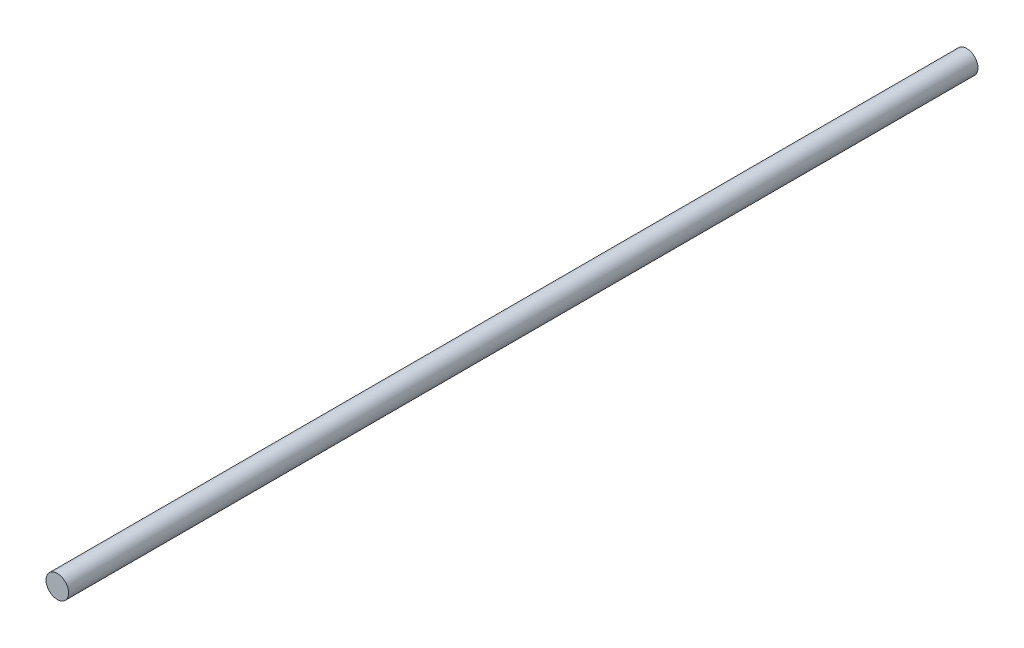
ISO-10303-21;
HEADER;
FILE_DESCRIPTION(('STEP AP214'),'2;1');
FILE_NAME('part.step','',(''),(''),'','','');
FILE_SCHEMA(('AUTOMOTIVE_DESIGN { 1 0 10303 214 1 1 1 1 }'));
ENDSEC;
DATA;
#1=APPLICATION_CONTEXT('core data for automotive mechanical design processes');
#2=APPLICATION_PROTOCOL_DEFINITION('international standard','automotive_design',2000,#1);
#3=PRODUCT_CONTEXT('',#1,'mechanical');
#4=PRODUCT('Part','Part','',(#3));
#5=PRODUCT_RELATED_PRODUCT_CATEGORY('part','',(#4));
#6=PRODUCT_DEFINITION_FORMATION('','',#4);
#7=PRODUCT_DEFINITION_CONTEXT('part definition',#1,'design');
#8=PRODUCT_DEFINITION('design','',#6,#7);
#9=PRODUCT_DEFINITION_SHAPE('','',#8);
#10=(LENGTH_UNIT() NAMED_UNIT(*) SI_UNIT(.MILLI.,.METRE.));
#11=(NAMED_UNIT(*) PLANE_ANGLE_UNIT() SI_UNIT($,.RADIAN.));
#12=(NAMED_UNIT(*) SI_UNIT($,.STERADIAN.) SOLID_ANGLE_UNIT());
#13=UNCERTAINTY_MEASURE_WITH_UNIT(LENGTH_MEASURE(1.E-05),#10,'distance_accuracy_value','');
#14=(GEOMETRIC_REPRESENTATION_CONTEXT(3) GLOBAL_UNCERTAINTY_ASSIGNED_CONTEXT((#13)) GLOBAL_UNIT_ASSIGNED_CONTEXT((#10,
#11,#12)) REPRESENTATION_CONTEXT('',''));
#15=CARTESIAN_POINT('',(0.,0.,0.));
#16=DIRECTION('',(0.,0.,1.));
#17=DIRECTION('',(1.,0.,0.));
#18=AXIS2_PLACEMENT_3D('',#15,#16,#17);
#19=CARTESIAN_POINT('',(0.,0.,361.8));
#20=DIRECTION('',(0.,0.,-1.));
#21=DIRECTION('',(-1.,0.,0.));
#22=AXIS2_PLACEMENT_3D('',#19,#20,#21);
#23=CYLINDRICAL_SURFACE('',#22,4.5);
#24=CARTESIAN_POINT('',(0.,0.,361.8));
#25=DIRECTION('',(0.,0.,1.));
#26=DIRECTION('',(1.,0.,0.));
#27=AXIS2_PLACEMENT_3D('',#24,#25,#26);
#28=CIRCLE('',#27,4.5);
#29=CARTESIAN_POINT('',(4.5,0.,361.8));
#30=VERTEX_POINT('',#29);
#31=EDGE_CURVE('E10',#30,#30,#28,.T.);
#32=ORIENTED_EDGE('',*,*,#31,.F.);
#33=EDGE_LOOP('',(#32));
#34=FACE_BOUND('',#33,.T.);
#35=CARTESIAN_POINT('',(0.,0.,0.));
#36=DIRECTION('',(0.,0.,1.));
#37=DIRECTION('',(1.,0.,0.));
#38=AXIS2_PLACEMENT_3D('',#35,#36,#37);
#39=CIRCLE('',#38,4.5);
#40=CARTESIAN_POINT('',(4.5,0.,0.));
#41=VERTEX_POINT('',#40);
#42=EDGE_CURVE('E40',#41,#41,#39,.T.);
#43=ORIENTED_EDGE('',*,*,#42,.T.);
#44=EDGE_LOOP('',(#43));
#45=FACE_BOUND('',#44,.T.);
#46=ADVANCED_FACE('F37',(#34,#45),#23,.T.);
#47=CARTESIAN_POINT('',(0.,0.,361.8));
#48=DIRECTION('',(0.,0.,1.));
#49=DIRECTION('',(1.,0.,0.));
#50=AXIS2_PLACEMENT_3D('',#47,#48,#49);
#51=PLANE('',#50);
#52=ORIENTED_EDGE('',*,*,#31,.T.);
#53=EDGE_LOOP('',(#52));
#54=FACE_BOUND('',#53,.T.);
#55=ADVANCED_FACE('F54',(#54),#51,.T.);
#56=CARTESIAN_POINT('',(0.,0.,0.));
#57=DIRECTION('',(0.,0.,1.));
#58=DIRECTION('',(1.,0.,0.));
#59=AXIS2_PLACEMENT_3D('',#56,#57,#58);
#60=PLANE('',#59);
#61=ORIENTED_EDGE('',*,*,#42,.F.);
#62=EDGE_LOOP('',(#61));
#63=FACE_BOUND('',#62,.T.);
#64=ADVANCED_FACE('F52',(#63),#60,.F.);
#65=CLOSED_SHELL('',(#46,#55,#64));
#66=MANIFOLD_SOLID_BREP('B2',#65);
#67=ADVANCED_BREP_SHAPE_REPRESENTATION('',(#18,#66),#14);
#68=SHAPE_DEFINITION_REPRESENTATION(#9,#67);
ENDSEC;
END-ISO-10303-21;
